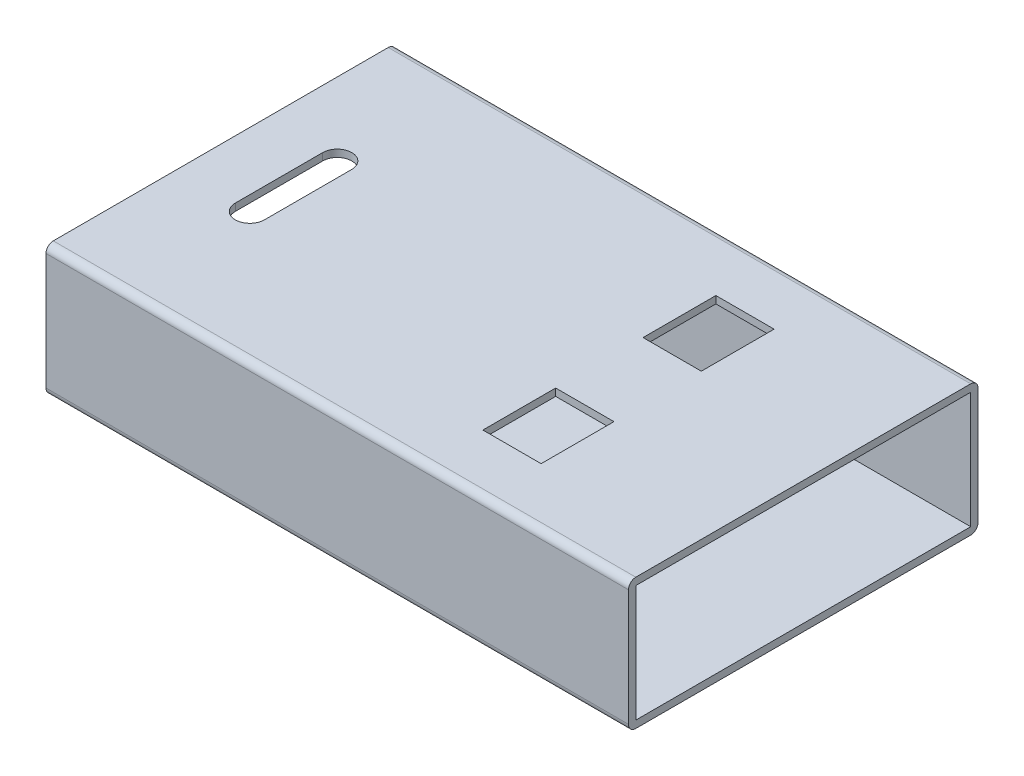
ISO-10303-21;
HEADER;
FILE_DESCRIPTION(('STEP AP214'),'2;1');
FILE_NAME('part.step','',(''),(''),'','','');
FILE_SCHEMA(('AUTOMOTIVE_DESIGN { 1 0 10303 214 1 1 1 1 }'));
ENDSEC;
DATA;
#1=APPLICATION_CONTEXT('core data for automotive mechanical design processes');
#2=APPLICATION_PROTOCOL_DEFINITION('international standard','automotive_design',2000,#1);
#3=PRODUCT_CONTEXT('',#1,'mechanical');
#4=PRODUCT('Part','Part','',(#3));
#5=PRODUCT_RELATED_PRODUCT_CATEGORY('part','',(#4));
#6=PRODUCT_DEFINITION_FORMATION('','',#4);
#7=PRODUCT_DEFINITION_CONTEXT('part definition',#1,'design');
#8=PRODUCT_DEFINITION('design','',#6,#7);
#9=PRODUCT_DEFINITION_SHAPE('','',#8);
#10=(LENGTH_UNIT() NAMED_UNIT(*) SI_UNIT(.MILLI.,.METRE.));
#11=(NAMED_UNIT(*) PLANE_ANGLE_UNIT() SI_UNIT($,.RADIAN.));
#12=(NAMED_UNIT(*) SI_UNIT($,.STERADIAN.) SOLID_ANGLE_UNIT());
#13=UNCERTAINTY_MEASURE_WITH_UNIT(LENGTH_MEASURE(1.E-05),#10,'distance_accuracy_value','');
#14=(GEOMETRIC_REPRESENTATION_CONTEXT(3) GLOBAL_UNCERTAINTY_ASSIGNED_CONTEXT((#13)) GLOBAL_UNIT_ASSIGNED_CONTEXT((#10,
#11,#12)) REPRESENTATION_CONTEXT('',''));
#15=CARTESIAN_POINT('',(0.,0.,0.));
#16=DIRECTION('',(0.,0.,1.));
#17=DIRECTION('',(1.,0.,0.));
#18=AXIS2_PLACEMENT_3D('',#15,#16,#17);
#19=CARTESIAN_POINT('',(-20.,2.,-5.75));
#20=DIRECTION('',(1.,0.,0.));
#21=DIRECTION('',(0.,0.,-1.));
#22=AXIS2_PLACEMENT_3D('',#19,#20,#21);
#23=CYLINDRICAL_SURFACE('',#22,0.25);
#24=CARTESIAN_POINT('',(0.,2.,-5.75));
#25=DIRECTION('',(1.,0.,0.));
#26=DIRECTION('',(0.,0.,1.));
#27=AXIS2_PLACEMENT_3D('',#24,#25,#26);
#28=CIRCLE('',#27,0.25);
#29=CARTESIAN_POINT('',(0.,2.,-6.));
#30=VERTEX_POINT('',#29);
#31=CARTESIAN_POINT('',(0.,2.25,-5.75));
#32=VERTEX_POINT('',#31);
#33=EDGE_CURVE('E488',#30,#32,#28,.T.);
#34=ORIENTED_EDGE('',*,*,#33,.F.);
#35=DIRECTION('',(1.,0.,0.));
#36=VECTOR('',#35,1.);
#37=CARTESIAN_POINT('',(-20.,2.,-6.));
#38=LINE('',#37,#36);
#39=CARTESIAN_POINT('',(-20.,2.,-6.));
#40=VERTEX_POINT('',#39);
#41=EDGE_CURVE('E543',#40,#30,#38,.T.);
#42=ORIENTED_EDGE('',*,*,#41,.F.);
#43=CARTESIAN_POINT('',(-20.,2.,-5.75));
#44=DIRECTION('',(1.,0.,0.));
#45=DIRECTION('',(0.,0.,1.));
#46=AXIS2_PLACEMENT_3D('',#43,#44,#45);
#47=CIRCLE('',#46,0.25);
#48=CARTESIAN_POINT('',(-20.,2.25,-5.75));
#49=VERTEX_POINT('',#48);
#50=EDGE_CURVE('E495',#40,#49,#47,.T.);
#51=ORIENTED_EDGE('',*,*,#50,.T.);
#52=DIRECTION('',(1.,0.,0.));
#53=VECTOR('',#52,1.);
#54=CARTESIAN_POINT('',(-20.,2.25,-5.75));
#55=LINE('',#54,#53);
#56=EDGE_CURVE('E520',#49,#32,#55,.T.);
#57=ORIENTED_EDGE('',*,*,#56,.T.);
#58=EDGE_LOOP('',(#34,#42,#51,#57));
#59=FACE_BOUND('',#58,.T.);
#60=ADVANCED_FACE('F73',(#59),#23,.T.);
#61=CARTESIAN_POINT('',(-20.,-2.,-6.));
#62=DIRECTION('',(0.,0.,-1.));
#63=DIRECTION('',(-1.,0.,0.));
#64=AXIS2_PLACEMENT_3D('',#61,#62,#63);
#65=PLANE('',#64);
#66=DIRECTION('',(0.,1.,0.));
#67=VECTOR('',#66,1.);
#68=CARTESIAN_POINT('',(0.,-2.,-6.));
#69=LINE('',#68,#67);
#70=CARTESIAN_POINT('',(0.,-2.,-6.));
#71=VERTEX_POINT('',#70);
#72=EDGE_CURVE('E499',#71,#30,#69,.T.);
#73=ORIENTED_EDGE('',*,*,#72,.F.);
#74=DIRECTION('',(1.,0.,0.));
#75=VECTOR('',#74,1.);
#76=CARTESIAN_POINT('',(-20.,-2.,-6.));
#77=LINE('',#76,#75);
#78=CARTESIAN_POINT('',(-20.,-2.,-6.));
#79=VERTEX_POINT('',#78);
#80=EDGE_CURVE('E546',#79,#71,#77,.T.);
#81=ORIENTED_EDGE('',*,*,#80,.F.);
#82=DIRECTION('',(0.,1.,0.));
#83=VECTOR('',#82,1.);
#84=CARTESIAN_POINT('',(-20.,-2.,-6.));
#85=LINE('',#84,#83);
#86=EDGE_CURVE('E517',#79,#40,#85,.T.);
#87=ORIENTED_EDGE('',*,*,#86,.T.);
#88=ORIENTED_EDGE('',*,*,#41,.T.);
#89=EDGE_LOOP('',(#73,#81,#87,#88));
#90=FACE_BOUND('',#89,.T.);
#91=ADVANCED_FACE('F618',(#90),#65,.T.);
#92=CARTESIAN_POINT('',(-20.,-2.,-5.75));
#93=DIRECTION('',(1.,0.,0.));
#94=DIRECTION('',(0.,0.,-1.));
#95=AXIS2_PLACEMENT_3D('',#92,#93,#94);
#96=CYLINDRICAL_SURFACE('',#95,0.25);
#97=CARTESIAN_POINT('',(0.,-2.,-5.75));
#98=DIRECTION('',(1.,0.,0.));
#99=DIRECTION('',(0.,0.,-1.));
#100=AXIS2_PLACEMENT_3D('',#97,#98,#99);
#101=CIRCLE('',#100,0.25);
#102=CARTESIAN_POINT('',(0.,-2.25,-5.75));
#103=VERTEX_POINT('',#102);
#104=EDGE_CURVE('E538',#103,#71,#101,.T.);
#105=ORIENTED_EDGE('',*,*,#104,.F.);
#106=DIRECTION('',(1.,0.,0.));
#107=VECTOR('',#106,1.);
#108=CARTESIAN_POINT('',(-20.,-2.25,-5.75));
#109=LINE('',#108,#107);
#110=CARTESIAN_POINT('',(-20.,-2.25,-5.75));
#111=VERTEX_POINT('',#110);
#112=EDGE_CURVE('E548',#111,#103,#109,.T.);
#113=ORIENTED_EDGE('',*,*,#112,.F.);
#114=CARTESIAN_POINT('',(-20.,-2.,-5.75));
#115=DIRECTION('',(1.,0.,0.));
#116=DIRECTION('',(0.,0.,-1.));
#117=AXIS2_PLACEMENT_3D('',#114,#115,#116);
#118=CIRCLE('',#117,0.25);
#119=EDGE_CURVE('E514',#111,#79,#118,.T.);
#120=ORIENTED_EDGE('',*,*,#119,.T.);
#121=ORIENTED_EDGE('',*,*,#80,.T.);
#122=EDGE_LOOP('',(#105,#113,#120,#121));
#123=FACE_BOUND('',#122,.T.);
#124=ADVANCED_FACE('F623',(#123),#96,.T.);
#125=CARTESIAN_POINT('',(-20.,-2.25,5.75));
#126=DIRECTION('',(0.,-1.,0.));
#127=DIRECTION('',(0.,0.,-1.));
#128=AXIS2_PLACEMENT_3D('',#125,#126,#127);
#129=PLANE('',#128);
#130=CARTESIAN_POINT('',(-17.5,-2.25,1.5));
#131=DIRECTION('',(0.,1.,0.));
#132=DIRECTION('',(0.,0.,1.));
#133=AXIS2_PLACEMENT_3D('',#130,#131,#132);
#134=CIRCLE('',#133,0.5);
#135=CARTESIAN_POINT('',(-18.,-2.25,1.5));
#136=VERTEX_POINT('',#135);
#137=CARTESIAN_POINT('',(-17.,-2.25,1.5));
#138=VERTEX_POINT('',#137);
#139=EDGE_CURVE('E312',#136,#138,#134,.T.);
#140=ORIENTED_EDGE('',*,*,#139,.T.);
#141=DIRECTION('',(0.,0.,-1.));
#142=VECTOR('',#141,1.);
#143=CARTESIAN_POINT('',(-17.,-2.25,1.5));
#144=LINE('',#143,#142);
#145=CARTESIAN_POINT('',(-17.,-2.25,-1.5));
#146=VERTEX_POINT('',#145);
#147=EDGE_CURVE('E322',#138,#146,#144,.T.);
#148=ORIENTED_EDGE('',*,*,#147,.T.);
#149=CARTESIAN_POINT('',(-17.5,-2.25,-1.5));
#150=DIRECTION('',(0.,1.,0.));
#151=DIRECTION('',(0.,0.,1.));
#152=AXIS2_PLACEMENT_3D('',#149,#150,#151);
#153=CIRCLE('',#152,0.5);
#154=CARTESIAN_POINT('',(-18.,-2.25,-1.5));
#155=VERTEX_POINT('',#154);
#156=EDGE_CURVE('E87',#146,#155,#153,.T.);
#157=ORIENTED_EDGE('',*,*,#156,.T.);
#158=DIRECTION('',(0.,0.,1.));
#159=VECTOR('',#158,1.);
#160=CARTESIAN_POINT('',(-18.,-2.25,1.5));
#161=LINE('',#160,#159);
#162=EDGE_CURVE('E330',#155,#136,#161,.T.);
#163=ORIENTED_EDGE('',*,*,#162,.T.);
#164=EDGE_LOOP('',(#140,#148,#157,#163));
#165=FACE_BOUND('',#164,.T.);
#166=DIRECTION('',(1.,0.,0.));
#167=VECTOR('',#166,1.);
#168=CARTESIAN_POINT('',(-7.,-2.25,-1.5));
#169=LINE('',#168,#167);
#170=CARTESIAN_POINT('',(-7.,-2.25,-1.5));
#171=VERTEX_POINT('',#170);
#172=CARTESIAN_POINT('',(-5.,-2.25,-1.5));
#173=VERTEX_POINT('',#172);
#174=EDGE_CURVE('E363',#171,#173,#169,.T.);
#175=ORIENTED_EDGE('',*,*,#174,.T.);
#176=DIRECTION('',(0.,0.,-1.));
#177=VECTOR('',#176,1.);
#178=CARTESIAN_POINT('',(-5.,-2.25,-1.5));
#179=LINE('',#178,#177);
#180=CARTESIAN_POINT('',(-5.,-2.25,-4.));
#181=VERTEX_POINT('',#180);
#182=EDGE_CURVE('E366',#173,#181,#179,.T.);
#183=ORIENTED_EDGE('',*,*,#182,.T.);
#184=DIRECTION('',(-1.,0.,0.));
#185=VECTOR('',#184,1.);
#186=CARTESIAN_POINT('',(-7.,-2.25,-4.));
#187=LINE('',#186,#185);
#188=CARTESIAN_POINT('',(-7.,-2.25,-4.));
#189=VERTEX_POINT('',#188);
#190=EDGE_CURVE('E370',#181,#189,#187,.T.);
#191=ORIENTED_EDGE('',*,*,#190,.T.);
#192=DIRECTION('',(0.,0.,1.));
#193=VECTOR('',#192,1.);
#194=CARTESIAN_POINT('',(-7.,-2.25,-1.5));
#195=LINE('',#194,#193);
#196=EDGE_CURVE('E373',#189,#171,#195,.T.);
#197=ORIENTED_EDGE('',*,*,#196,.T.);
#198=EDGE_LOOP('',(#175,#183,#191,#197));
#199=FACE_BOUND('',#198,.T.);
#200=DIRECTION('',(0.,0.,-1.));
#201=VECTOR('',#200,1.);
#202=CARTESIAN_POINT('',(-5.,-2.25,1.5));
#203=LINE('',#202,#201);
#204=CARTESIAN_POINT('',(-5.,-2.25,4.));
#205=VERTEX_POINT('',#204);
#206=CARTESIAN_POINT('',(-5.,-2.25,1.5));
#207=VERTEX_POINT('',#206);
#208=EDGE_CURVE('E413',#205,#207,#203,.T.);
#209=ORIENTED_EDGE('',*,*,#208,.T.);
#210=DIRECTION('',(-1.,0.,0.));
#211=VECTOR('',#210,1.);
#212=CARTESIAN_POINT('',(-7.,-2.25,1.5));
#213=LINE('',#212,#211);
#214=CARTESIAN_POINT('',(-7.,-2.25,1.5));
#215=VERTEX_POINT('',#214);
#216=EDGE_CURVE('E416',#207,#215,#213,.T.);
#217=ORIENTED_EDGE('',*,*,#216,.T.);
#218=DIRECTION('',(0.,0.,1.));
#219=VECTOR('',#218,1.);
#220=CARTESIAN_POINT('',(-7.,-2.25,1.5));
#221=LINE('',#220,#219);
#222=CARTESIAN_POINT('',(-7.,-2.25,4.));
#223=VERTEX_POINT('',#222);
#224=EDGE_CURVE('E420',#215,#223,#221,.T.);
#225=ORIENTED_EDGE('',*,*,#224,.T.);
#226=DIRECTION('',(1.,0.,0.));
#227=VECTOR('',#226,1.);
#228=CARTESIAN_POINT('',(-7.,-2.25,4.));
#229=LINE('',#228,#227);
#230=EDGE_CURVE('E423',#223,#205,#229,.T.);
#231=ORIENTED_EDGE('',*,*,#230,.T.);
#232=EDGE_LOOP('',(#209,#217,#225,#231));
#233=FACE_BOUND('',#232,.T.);
#234=DIRECTION('',(0.,0.,-1.));
#235=VECTOR('',#234,1.);
#236=CARTESIAN_POINT('',(0.,-2.25,5.75));
#237=LINE('',#236,#235);
#238=CARTESIAN_POINT('',(0.,-2.25,5.75));
#239=VERTEX_POINT('',#238);
#240=EDGE_CURVE('E535',#239,#103,#237,.T.);
#241=ORIENTED_EDGE('',*,*,#240,.F.);
#242=DIRECTION('',(1.,0.,0.));
#243=VECTOR('',#242,1.);
#244=CARTESIAN_POINT('',(-20.,-2.25,5.75));
#245=LINE('',#244,#243);
#246=CARTESIAN_POINT('',(-20.,-2.25,5.75));
#247=VERTEX_POINT('',#246);
#248=EDGE_CURVE('E550',#247,#239,#245,.T.);
#249=ORIENTED_EDGE('',*,*,#248,.F.);
#250=DIRECTION('',(0.,0.,-1.));
#251=VECTOR('',#250,1.);
#252=CARTESIAN_POINT('',(-20.,-2.25,5.75));
#253=LINE('',#252,#251);
#254=EDGE_CURVE('E511',#247,#111,#253,.T.);
#255=ORIENTED_EDGE('',*,*,#254,.T.);
#256=ORIENTED_EDGE('',*,*,#112,.T.);
#257=EDGE_LOOP('',(#241,#249,#255,#256));
#258=FACE_BOUND('',#257,.T.);
#259=ADVANCED_FACE('F327',(#165,#199,#233,#258),#129,.T.);
#260=CARTESIAN_POINT('',(-20.,-2.,5.75));
#261=DIRECTION('',(1.,0.,0.));
#262=DIRECTION('',(0.,0.,-1.));
#263=AXIS2_PLACEMENT_3D('',#260,#261,#262);
#264=CYLINDRICAL_SURFACE('',#263,0.25);
#265=CARTESIAN_POINT('',(0.,-2.,5.75));
#266=DIRECTION('',(1.,0.,0.));
#267=DIRECTION('',(0.,0.,1.));
#268=AXIS2_PLACEMENT_3D('',#265,#266,#267);
#269=CIRCLE('',#268,0.25);
#270=CARTESIAN_POINT('',(0.,-2.,6.));
#271=VERTEX_POINT('',#270);
#272=EDGE_CURVE('E532',#271,#239,#269,.T.);
#273=ORIENTED_EDGE('',*,*,#272,.F.);
#274=DIRECTION('',(1.,0.,0.));
#275=VECTOR('',#274,1.);
#276=CARTESIAN_POINT('',(-20.,-2.,6.));
#277=LINE('',#276,#275);
#278=CARTESIAN_POINT('',(-20.,-2.,6.));
#279=VERTEX_POINT('',#278);
#280=EDGE_CURVE('E552',#279,#271,#277,.T.);
#281=ORIENTED_EDGE('',*,*,#280,.F.);
#282=CARTESIAN_POINT('',(-20.,-2.,5.75));
#283=DIRECTION('',(1.,0.,0.));
#284=DIRECTION('',(0.,0.,1.));
#285=AXIS2_PLACEMENT_3D('',#282,#283,#284);
#286=CIRCLE('',#285,0.25);
#287=EDGE_CURVE('E508',#279,#247,#286,.T.);
#288=ORIENTED_EDGE('',*,*,#287,.T.);
#289=ORIENTED_EDGE('',*,*,#248,.T.);
#290=EDGE_LOOP('',(#273,#281,#288,#289));
#291=FACE_BOUND('',#290,.T.);
#292=ADVANCED_FACE('F651',(#291),#264,.T.);
#293=CARTESIAN_POINT('',(-20.,-2.,6.));
#294=DIRECTION('',(0.,0.,1.));
#295=DIRECTION('',(1.,0.,0.));
#296=AXIS2_PLACEMENT_3D('',#293,#294,#295);
#297=PLANE('',#296);
#298=DIRECTION('',(0.,-1.,0.));
#299=VECTOR('',#298,1.);
#300=CARTESIAN_POINT('',(0.,-2.,6.));
#301=LINE('',#300,#299);
#302=CARTESIAN_POINT('',(0.,2.,6.));
#303=VERTEX_POINT('',#302);
#304=EDGE_CURVE('E529',#303,#271,#301,.T.);
#305=ORIENTED_EDGE('',*,*,#304,.F.);
#306=DIRECTION('',(1.,0.,0.));
#307=VECTOR('',#306,1.);
#308=CARTESIAN_POINT('',(-20.,2.,6.));
#309=LINE('',#308,#307);
#310=CARTESIAN_POINT('',(-20.,2.,6.));
#311=VERTEX_POINT('',#310);
#312=EDGE_CURVE('E554',#311,#303,#309,.T.);
#313=ORIENTED_EDGE('',*,*,#312,.F.);
#314=DIRECTION('',(0.,-1.,0.));
#315=VECTOR('',#314,1.);
#316=CARTESIAN_POINT('',(-20.,-2.,6.));
#317=LINE('',#316,#315);
#318=EDGE_CURVE('E505',#311,#279,#317,.T.);
#319=ORIENTED_EDGE('',*,*,#318,.T.);
#320=ORIENTED_EDGE('',*,*,#280,.T.);
#321=EDGE_LOOP('',(#305,#313,#319,#320));
#322=FACE_BOUND('',#321,.T.);
#323=ADVANCED_FACE('F647',(#322),#297,.T.);
#324=CARTESIAN_POINT('',(-20.,2.,5.75));
#325=DIRECTION('',(1.,0.,0.));
#326=DIRECTION('',(0.,0.,-1.));
#327=AXIS2_PLACEMENT_3D('',#324,#325,#326);
#328=CYLINDRICAL_SURFACE('',#327,0.25);
#329=CARTESIAN_POINT('',(0.,2.,5.75));
#330=DIRECTION('',(1.,0.,0.));
#331=DIRECTION('',(0.,0.,1.));
#332=AXIS2_PLACEMENT_3D('',#329,#330,#331);
#333=CIRCLE('',#332,0.25);
#334=CARTESIAN_POINT('',(0.,2.25,5.75));
#335=VERTEX_POINT('',#334);
#336=EDGE_CURVE('E526',#335,#303,#333,.T.);
#337=ORIENTED_EDGE('',*,*,#336,.F.);
#338=DIRECTION('',(1.,0.,0.));
#339=VECTOR('',#338,1.);
#340=CARTESIAN_POINT('',(-20.,2.25,5.75));
#341=LINE('',#340,#339);
#342=CARTESIAN_POINT('',(-20.,2.25,5.75));
#343=VERTEX_POINT('',#342);
#344=EDGE_CURVE('E556',#343,#335,#341,.T.);
#345=ORIENTED_EDGE('',*,*,#344,.F.);
#346=CARTESIAN_POINT('',(-20.,2.,5.75));
#347=DIRECTION('',(1.,0.,0.));
#348=DIRECTION('',(0.,0.,1.));
#349=AXIS2_PLACEMENT_3D('',#346,#347,#348);
#350=CIRCLE('',#349,0.25);
#351=EDGE_CURVE('E502',#343,#311,#350,.T.);
#352=ORIENTED_EDGE('',*,*,#351,.T.);
#353=ORIENTED_EDGE('',*,*,#312,.T.);
#354=EDGE_LOOP('',(#337,#345,#352,#353));
#355=FACE_BOUND('',#354,.T.);
#356=ADVANCED_FACE('F645',(#355),#328,.T.);
#357=CARTESIAN_POINT('',(-20.,2.25,5.75));
#358=DIRECTION('',(0.,1.,0.));
#359=DIRECTION('',(0.,0.,1.));
#360=AXIS2_PLACEMENT_3D('',#357,#358,#359);
#361=PLANE('',#360);
#362=CARTESIAN_POINT('',(-17.5,2.25,1.5));
#363=DIRECTION('',(0.,1.,0.));
#364=DIRECTION('',(0.,0.,1.));
#365=AXIS2_PLACEMENT_3D('',#362,#363,#364);
#366=CIRCLE('',#365,0.5);
#367=CARTESIAN_POINT('',(-18.,2.25,1.5));
#368=VERTEX_POINT('',#367);
#369=CARTESIAN_POINT('',(-17.,2.25,1.5));
#370=VERTEX_POINT('',#369);
#371=EDGE_CURVE('E95',#368,#370,#366,.T.);
#372=ORIENTED_EDGE('',*,*,#371,.F.);
#373=DIRECTION('',(0.,0.,1.));
#374=VECTOR('',#373,1.);
#375=CARTESIAN_POINT('',(-18.,2.25,1.5));
#376=LINE('',#375,#374);
#377=CARTESIAN_POINT('',(-18.,2.25,-1.5));
#378=VERTEX_POINT('',#377);
#379=EDGE_CURVE('E331',#378,#368,#376,.T.);
#380=ORIENTED_EDGE('',*,*,#379,.F.);
#381=CARTESIAN_POINT('',(-17.5,2.25,-1.5));
#382=DIRECTION('',(0.,1.,0.));
#383=DIRECTION('',(0.,0.,1.));
#384=AXIS2_PLACEMENT_3D('',#381,#382,#383);
#385=CIRCLE('',#384,0.5);
#386=CARTESIAN_POINT('',(-17.,2.25,-1.5));
#387=VERTEX_POINT('',#386);
#388=EDGE_CURVE('E334',#387,#378,#385,.T.);
#389=ORIENTED_EDGE('',*,*,#388,.F.);
#390=DIRECTION('',(0.,0.,-1.));
#391=VECTOR('',#390,1.);
#392=CARTESIAN_POINT('',(-17.,2.25,1.5));
#393=LINE('',#392,#391);
#394=EDGE_CURVE('E340',#370,#387,#393,.T.);
#395=ORIENTED_EDGE('',*,*,#394,.F.);
#396=EDGE_LOOP('',(#372,#380,#389,#395));
#397=FACE_BOUND('',#396,.T.);
#398=DIRECTION('',(1.,0.,0.));
#399=VECTOR('',#398,1.);
#400=CARTESIAN_POINT('',(-7.,2.25,-1.5));
#401=LINE('',#400,#399);
#402=CARTESIAN_POINT('',(-7.,2.25,-1.5));
#403=VERTEX_POINT('',#402);
#404=CARTESIAN_POINT('',(-5.,2.25,-1.5));
#405=VERTEX_POINT('',#404);
#406=EDGE_CURVE('E362',#403,#405,#401,.T.);
#407=ORIENTED_EDGE('',*,*,#406,.F.);
#408=DIRECTION('',(0.,0.,1.));
#409=VECTOR('',#408,1.);
#410=CARTESIAN_POINT('',(-7.,2.25,-1.5));
#411=LINE('',#410,#409);
#412=CARTESIAN_POINT('',(-7.,2.25,-4.));
#413=VERTEX_POINT('',#412);
#414=EDGE_CURVE('E367',#413,#403,#411,.T.);
#415=ORIENTED_EDGE('',*,*,#414,.F.);
#416=DIRECTION('',(-1.,0.,0.));
#417=VECTOR('',#416,1.);
#418=CARTESIAN_POINT('',(-7.,2.25,-4.));
#419=LINE('',#418,#417);
#420=CARTESIAN_POINT('',(-5.,2.25,-4.));
#421=VERTEX_POINT('',#420);
#422=EDGE_CURVE('E381',#421,#413,#419,.T.);
#423=ORIENTED_EDGE('',*,*,#422,.F.);
#424=DIRECTION('',(0.,0.,-1.));
#425=VECTOR('',#424,1.);
#426=CARTESIAN_POINT('',(-5.,2.25,-1.5));
#427=LINE('',#426,#425);
#428=EDGE_CURVE('E378',#405,#421,#427,.T.);
#429=ORIENTED_EDGE('',*,*,#428,.F.);
#430=EDGE_LOOP('',(#407,#415,#423,#429));
#431=FACE_BOUND('',#430,.T.);
#432=DIRECTION('',(0.,0.,-1.));
#433=VECTOR('',#432,1.);
#434=CARTESIAN_POINT('',(-5.,2.25,1.5));
#435=LINE('',#434,#433);
#436=CARTESIAN_POINT('',(-5.,2.25,4.));
#437=VERTEX_POINT('',#436);
#438=CARTESIAN_POINT('',(-5.,2.25,1.5));
#439=VERTEX_POINT('',#438);
#440=EDGE_CURVE('E412',#437,#439,#435,.T.);
#441=ORIENTED_EDGE('',*,*,#440,.F.);
#442=DIRECTION('',(1.,0.,0.));
#443=VECTOR('',#442,1.);
#444=CARTESIAN_POINT('',(-7.,2.25,4.));
#445=LINE('',#444,#443);
#446=CARTESIAN_POINT('',(-7.,2.25,4.));
#447=VERTEX_POINT('',#446);
#448=EDGE_CURVE('E417',#447,#437,#445,.T.);
#449=ORIENTED_EDGE('',*,*,#448,.F.);
#450=DIRECTION('',(0.,0.,1.));
#451=VECTOR('',#450,1.);
#452=CARTESIAN_POINT('',(-7.,2.25,1.5));
#453=LINE('',#452,#451);
#454=CARTESIAN_POINT('',(-7.,2.25,1.5));
#455=VERTEX_POINT('',#454);
#456=EDGE_CURVE('E431',#455,#447,#453,.T.);
#457=ORIENTED_EDGE('',*,*,#456,.F.);
#458=DIRECTION('',(-1.,0.,0.));
#459=VECTOR('',#458,1.);
#460=CARTESIAN_POINT('',(-7.,2.25,1.5));
#461=LINE('',#460,#459);
#462=EDGE_CURVE('E428',#439,#455,#461,.T.);
#463=ORIENTED_EDGE('',*,*,#462,.F.);
#464=EDGE_LOOP('',(#441,#449,#457,#463));
#465=FACE_BOUND('',#464,.T.);
#466=DIRECTION('',(0.,0.,1.));
#467=VECTOR('',#466,1.);
#468=CARTESIAN_POINT('',(0.,2.25,5.75));
#469=LINE('',#468,#467);
#470=EDGE_CURVE('E523',#32,#335,#469,.T.);
#471=ORIENTED_EDGE('',*,*,#470,.F.);
#472=ORIENTED_EDGE('',*,*,#56,.F.);
#473=DIRECTION('',(0.,0.,1.));
#474=VECTOR('',#473,1.);
#475=CARTESIAN_POINT('',(-20.,2.25,5.75));
#476=LINE('',#475,#474);
#477=EDGE_CURVE('E498',#49,#343,#476,.T.);
#478=ORIENTED_EDGE('',*,*,#477,.T.);
#479=ORIENTED_EDGE('',*,*,#344,.T.);
#480=EDGE_LOOP('',(#471,#472,#478,#479));
#481=FACE_BOUND('',#480,.T.);
#482=ADVANCED_FACE('F602',(#397,#431,#465,#481),#361,.T.);
#483=CARTESIAN_POINT('',(-20.,2.,-5.75));
#484=DIRECTION('',(1.,0.,0.));
#485=DIRECTION('',(0.,0.,-1.));
#486=AXIS2_PLACEMENT_3D('',#483,#484,#485);
#487=PLANE('',#486);
#488=DIRECTION('',(0.,0.,-1.));
#489=VECTOR('',#488,1.);
#490=CARTESIAN_POINT('',(-20.,-2.,-5.75));
#491=LINE('',#490,#489);
#492=CARTESIAN_POINT('',(-20.,-2.,5.75));
#493=VERTEX_POINT('',#492);
#494=CARTESIAN_POINT('',(-20.,-2.,-5.75));
#495=VERTEX_POINT('',#494);
#496=EDGE_CURVE('E473',#493,#495,#491,.T.);
#497=ORIENTED_EDGE('',*,*,#496,.T.);
#498=DIRECTION('',(0.,1.,0.));
#499=VECTOR('',#498,1.);
#500=CARTESIAN_POINT('',(-20.,2.,-5.75));
#501=LINE('',#500,#499);
#502=CARTESIAN_POINT('',(-20.,2.,-5.75));
#503=VERTEX_POINT('',#502);
#504=EDGE_CURVE('E463',#495,#503,#501,.T.);
#505=ORIENTED_EDGE('',*,*,#504,.T.);
#506=DIRECTION('',(0.,0.,1.));
#507=VECTOR('',#506,1.);
#508=CARTESIAN_POINT('',(-20.,2.,-5.75));
#509=LINE('',#508,#507);
#510=CARTESIAN_POINT('',(-20.,2.,5.75));
#511=VERTEX_POINT('',#510);
#512=EDGE_CURVE('E466',#503,#511,#509,.T.);
#513=ORIENTED_EDGE('',*,*,#512,.T.);
#514=DIRECTION('',(0.,-1.,0.));
#515=VECTOR('',#514,1.);
#516=CARTESIAN_POINT('',(-20.,2.,5.75));
#517=LINE('',#516,#515);
#518=EDGE_CURVE('E470',#511,#493,#517,.T.);
#519=ORIENTED_EDGE('',*,*,#518,.T.);
#520=EDGE_LOOP('',(#497,#505,#513,#519));
#521=FACE_BOUND('',#520,.T.);
#522=ORIENTED_EDGE('',*,*,#50,.F.);
#523=ORIENTED_EDGE('',*,*,#86,.F.);
#524=ORIENTED_EDGE('',*,*,#119,.F.);
#525=ORIENTED_EDGE('',*,*,#254,.F.);
#526=ORIENTED_EDGE('',*,*,#287,.F.);
#527=ORIENTED_EDGE('',*,*,#318,.F.);
#528=ORIENTED_EDGE('',*,*,#351,.F.);
#529=ORIENTED_EDGE('',*,*,#477,.F.);
#530=EDGE_LOOP('',(#522,#523,#524,#525,#526,#527,#528,#529));
#531=FACE_BOUND('',#530,.T.);
#532=ADVANCED_FACE('F636',(#521,#531),#487,.F.);
#533=CARTESIAN_POINT('',(0.,2.,-5.75));
#534=DIRECTION('',(1.,0.,0.));
#535=DIRECTION('',(0.,0.,-1.));
#536=AXIS2_PLACEMENT_3D('',#533,#534,#535);
#537=PLANE('',#536);
#538=DIRECTION('',(0.,1.,0.));
#539=VECTOR('',#538,1.);
#540=CARTESIAN_POINT('',(0.,2.,-5.75));
#541=LINE('',#540,#539);
#542=CARTESIAN_POINT('',(0.,-2.,-5.75));
#543=VERTEX_POINT('',#542);
#544=CARTESIAN_POINT('',(0.,2.,-5.75));
#545=VERTEX_POINT('',#544);
#546=EDGE_CURVE('E462',#543,#545,#541,.T.);
#547=ORIENTED_EDGE('',*,*,#546,.F.);
#548=DIRECTION('',(0.,0.,-1.));
#549=VECTOR('',#548,1.);
#550=CARTESIAN_POINT('',(0.,-2.,-5.75));
#551=LINE('',#550,#549);
#552=CARTESIAN_POINT('',(0.,-2.,5.75));
#553=VERTEX_POINT('',#552);
#554=EDGE_CURVE('E467',#553,#543,#551,.T.);
#555=ORIENTED_EDGE('',*,*,#554,.F.);
#556=DIRECTION('',(0.,-1.,0.));
#557=VECTOR('',#556,1.);
#558=CARTESIAN_POINT('',(0.,2.,5.75));
#559=LINE('',#558,#557);
#560=CARTESIAN_POINT('',(0.,2.,5.75));
#561=VERTEX_POINT('',#560);
#562=EDGE_CURVE('E481',#561,#553,#559,.T.);
#563=ORIENTED_EDGE('',*,*,#562,.F.);
#564=DIRECTION('',(0.,0.,1.));
#565=VECTOR('',#564,1.);
#566=CARTESIAN_POINT('',(0.,2.,-5.75));
#567=LINE('',#566,#565);
#568=EDGE_CURVE('E478',#545,#561,#567,.T.);
#569=ORIENTED_EDGE('',*,*,#568,.F.);
#570=EDGE_LOOP('',(#547,#555,#563,#569));
#571=FACE_BOUND('',#570,.T.);
#572=ORIENTED_EDGE('',*,*,#33,.T.);
#573=ORIENTED_EDGE('',*,*,#470,.T.);
#574=ORIENTED_EDGE('',*,*,#336,.T.);
#575=ORIENTED_EDGE('',*,*,#304,.T.);
#576=ORIENTED_EDGE('',*,*,#272,.T.);
#577=ORIENTED_EDGE('',*,*,#240,.T.);
#578=ORIENTED_EDGE('',*,*,#104,.T.);
#579=ORIENTED_EDGE('',*,*,#72,.T.);
#580=EDGE_LOOP('',(#572,#573,#574,#575,#576,#577,#578,#579));
#581=FACE_BOUND('',#580,.T.);
#582=ADVANCED_FACE('F631',(#571,#581),#537,.T.);
#583=CARTESIAN_POINT('',(-20.,2.,-5.75));
#584=DIRECTION('',(0.,0.,-1.));
#585=DIRECTION('',(-1.,0.,0.));
#586=AXIS2_PLACEMENT_3D('',#583,#584,#585);
#587=PLANE('',#586);
#588=ORIENTED_EDGE('',*,*,#546,.T.);
#589=DIRECTION('',(1.,0.,0.));
#590=VECTOR('',#589,1.);
#591=CARTESIAN_POINT('',(-20.,2.,-5.75));
#592=LINE('',#591,#590);
#593=EDGE_CURVE('E476',#503,#545,#592,.T.);
#594=ORIENTED_EDGE('',*,*,#593,.F.);
#595=ORIENTED_EDGE('',*,*,#504,.F.);
#596=DIRECTION('',(1.,0.,0.));
#597=VECTOR('',#596,1.);
#598=CARTESIAN_POINT('',(-20.,-2.,-5.75));
#599=LINE('',#598,#597);
#600=EDGE_CURVE('E486',#495,#543,#599,.T.);
#601=ORIENTED_EDGE('',*,*,#600,.T.);
#602=EDGE_LOOP('',(#588,#594,#595,#601));
#603=FACE_BOUND('',#602,.T.);
#604=ADVANCED_FACE('F677',(#603),#587,.F.);
#605=CARTESIAN_POINT('',(-20.,-2.,-5.75));
#606=DIRECTION('',(0.,-1.,0.));
#607=DIRECTION('',(0.,0.,-1.));
#608=AXIS2_PLACEMENT_3D('',#605,#606,#607);
#609=PLANE('',#608);
#610=DIRECTION('',(0.,0.,1.));
#611=VECTOR('',#610,1.);
#612=CARTESIAN_POINT('',(-17.,-2.,-5.75));
#613=LINE('',#612,#611);
#614=CARTESIAN_POINT('',(-17.,-2.,-1.5));
#615=VERTEX_POINT('',#614);
#616=CARTESIAN_POINT('',(-17.,-2.,1.5));
#617=VERTEX_POINT('',#616);
#618=EDGE_CURVE('E347',#615,#617,#613,.T.);
#619=ORIENTED_EDGE('',*,*,#618,.T.);
#620=CARTESIAN_POINT('',(-17.5,-2.,1.5));
#621=DIRECTION('',(0.,-1.,0.));
#622=DIRECTION('',(0.,0.,-1.));
#623=AXIS2_PLACEMENT_3D('',#620,#621,#622);
#624=CIRCLE('',#623,0.5);
#625=CARTESIAN_POINT('',(-18.,-2.,1.5));
#626=VERTEX_POINT('',#625);
#627=EDGE_CURVE('E315',#617,#626,#624,.T.);
#628=ORIENTED_EDGE('',*,*,#627,.T.);
#629=DIRECTION('',(0.,0.,-1.));
#630=VECTOR('',#629,1.);
#631=CARTESIAN_POINT('',(-18.,-2.,-5.75));
#632=LINE('',#631,#630);
#633=CARTESIAN_POINT('',(-18.,-2.,-1.5));
#634=VERTEX_POINT('',#633);
#635=EDGE_CURVE('E358',#626,#634,#632,.T.);
#636=ORIENTED_EDGE('',*,*,#635,.T.);
#637=CARTESIAN_POINT('',(-17.5,-2.,-1.5));
#638=DIRECTION('',(0.,-1.,0.));
#639=DIRECTION('',(0.,0.,-1.));
#640=AXIS2_PLACEMENT_3D('',#637,#638,#639);
#641=CIRCLE('',#640,0.5);
#642=EDGE_CURVE('E355',#634,#615,#641,.T.);
#643=ORIENTED_EDGE('',*,*,#642,.T.);
#644=EDGE_LOOP('',(#619,#628,#636,#643));
#645=FACE_BOUND('',#644,.T.);
#646=DIRECTION('',(0.,0.,1.));
#647=VECTOR('',#646,1.);
#648=CARTESIAN_POINT('',(-5.,-2.,-5.75));
#649=LINE('',#648,#647);
#650=CARTESIAN_POINT('',(-5.,-2.,-4.));
#651=VERTEX_POINT('',#650);
#652=CARTESIAN_POINT('',(-5.,-2.,-1.5));
#653=VERTEX_POINT('',#652);
#654=EDGE_CURVE('E389',#651,#653,#649,.T.);
#655=ORIENTED_EDGE('',*,*,#654,.T.);
#656=DIRECTION('',(-1.,0.,0.));
#657=VECTOR('',#656,1.);
#658=CARTESIAN_POINT('',(-20.,-2.,-1.5));
#659=LINE('',#658,#657);
#660=CARTESIAN_POINT('',(-7.,-2.,-1.5));
#661=VERTEX_POINT('',#660);
#662=EDGE_CURVE('E409',#653,#661,#659,.T.);
#663=ORIENTED_EDGE('',*,*,#662,.T.);
#664=DIRECTION('',(0.,0.,-1.));
#665=VECTOR('',#664,1.);
#666=CARTESIAN_POINT('',(-7.,-2.,-5.75));
#667=LINE('',#666,#665);
#668=CARTESIAN_POINT('',(-7.,-2.,-4.));
#669=VERTEX_POINT('',#668);
#670=EDGE_CURVE('E406',#661,#669,#667,.T.);
#671=ORIENTED_EDGE('',*,*,#670,.T.);
#672=DIRECTION('',(1.,0.,0.));
#673=VECTOR('',#672,1.);
#674=CARTESIAN_POINT('',(-20.,-2.,-3.99999999999999));
#675=LINE('',#674,#673);
#676=EDGE_CURVE('E403',#669,#651,#675,.T.);
#677=ORIENTED_EDGE('',*,*,#676,.T.);
#678=EDGE_LOOP('',(#655,#663,#671,#677));
#679=FACE_BOUND('',#678,.T.);
#680=DIRECTION('',(1.,0.,0.));
#681=VECTOR('',#680,1.);
#682=CARTESIAN_POINT('',(-20.,-2.,1.5));
#683=LINE('',#682,#681);
#684=CARTESIAN_POINT('',(-7.,-2.,1.5));
#685=VERTEX_POINT('',#684);
#686=CARTESIAN_POINT('',(-5.,-2.,1.5));
#687=VERTEX_POINT('',#686);
#688=EDGE_CURVE('E439',#685,#687,#683,.T.);
#689=ORIENTED_EDGE('',*,*,#688,.T.);
#690=DIRECTION('',(0.,0.,1.));
#691=VECTOR('',#690,1.);
#692=CARTESIAN_POINT('',(-5.,-2.,-5.75000000000001));
#693=LINE('',#692,#691);
#694=CARTESIAN_POINT('',(-5.,-2.,4.));
#695=VERTEX_POINT('',#694);
#696=EDGE_CURVE('E459',#687,#695,#693,.T.);
#697=ORIENTED_EDGE('',*,*,#696,.T.);
#698=DIRECTION('',(-1.,0.,0.));
#699=VECTOR('',#698,1.);
#700=CARTESIAN_POINT('',(-20.,-2.,3.99999999999999));
#701=LINE('',#700,#699);
#702=CARTESIAN_POINT('',(-7.,-2.,4.));
#703=VERTEX_POINT('',#702);
#704=EDGE_CURVE('E456',#695,#703,#701,.T.);
#705=ORIENTED_EDGE('',*,*,#704,.T.);
#706=DIRECTION('',(0.,0.,-1.));
#707=VECTOR('',#706,1.);
#708=CARTESIAN_POINT('',(-7.,-2.,-5.75));
#709=LINE('',#708,#707);
#710=EDGE_CURVE('E453',#703,#685,#709,.T.);
#711=ORIENTED_EDGE('',*,*,#710,.T.);
#712=EDGE_LOOP('',(#689,#697,#705,#711));
#713=FACE_BOUND('',#712,.T.);
#714=ORIENTED_EDGE('',*,*,#554,.T.);
#715=ORIENTED_EDGE('',*,*,#600,.F.);
#716=ORIENTED_EDGE('',*,*,#496,.F.);
#717=DIRECTION('',(1.,0.,0.));
#718=VECTOR('',#717,1.);
#719=CARTESIAN_POINT('',(-20.,-2.,5.75));
#720=LINE('',#719,#718);
#721=EDGE_CURVE('E489',#493,#553,#720,.T.);
#722=ORIENTED_EDGE('',*,*,#721,.T.);
#723=EDGE_LOOP('',(#714,#715,#716,#722));
#724=FACE_BOUND('',#723,.T.);
#725=ADVANCED_FACE('F682',(#645,#679,#713,#724),#609,.F.);
#726=CARTESIAN_POINT('',(-20.,2.,5.75));
#727=DIRECTION('',(0.,0.,1.));
#728=DIRECTION('',(1.,0.,0.));
#729=AXIS2_PLACEMENT_3D('',#726,#727,#728);
#730=PLANE('',#729);
#731=ORIENTED_EDGE('',*,*,#562,.T.);
#732=ORIENTED_EDGE('',*,*,#721,.F.);
#733=ORIENTED_EDGE('',*,*,#518,.F.);
#734=DIRECTION('',(1.,0.,0.));
#735=VECTOR('',#734,1.);
#736=CARTESIAN_POINT('',(-20.,2.,5.75));
#737=LINE('',#736,#735);
#738=EDGE_CURVE('E491',#511,#561,#737,.T.);
#739=ORIENTED_EDGE('',*,*,#738,.T.);
#740=EDGE_LOOP('',(#731,#732,#733,#739));
#741=FACE_BOUND('',#740,.T.);
#742=ADVANCED_FACE('F687',(#741),#730,.F.);
#743=CARTESIAN_POINT('',(-20.,2.,-5.75));
#744=DIRECTION('',(0.,1.,0.));
#745=DIRECTION('',(0.,0.,1.));
#746=AXIS2_PLACEMENT_3D('',#743,#744,#745);
#747=PLANE('',#746);
#748=DIRECTION('',(0.,0.,1.));
#749=VECTOR('',#748,1.);
#750=CARTESIAN_POINT('',(-18.,2.,-5.75));
#751=LINE('',#750,#749);
#752=CARTESIAN_POINT('',(-18.,2.,-1.5));
#753=VERTEX_POINT('',#752);
#754=CARTESIAN_POINT('',(-18.,2.,1.5));
#755=VERTEX_POINT('',#754);
#756=EDGE_CURVE('E80',#753,#755,#751,.T.);
#757=ORIENTED_EDGE('',*,*,#756,.T.);
#758=CARTESIAN_POINT('',(-17.5,2.,1.5));
#759=DIRECTION('',(0.,1.,0.));
#760=DIRECTION('',(0.,0.,1.));
#761=AXIS2_PLACEMENT_3D('',#758,#759,#760);
#762=CIRCLE('',#761,0.5);
#763=CARTESIAN_POINT('',(-17.,2.,1.5));
#764=VERTEX_POINT('',#763);
#765=EDGE_CURVE('E12',#755,#764,#762,.T.);
#766=ORIENTED_EDGE('',*,*,#765,.T.);
#767=DIRECTION('',(0.,0.,-1.));
#768=VECTOR('',#767,1.);
#769=CARTESIAN_POINT('',(-17.,2.,-5.75));
#770=LINE('',#769,#768);
#771=CARTESIAN_POINT('',(-17.,2.,-1.5));
#772=VERTEX_POINT('',#771);
#773=EDGE_CURVE('E582',#764,#772,#770,.T.);
#774=ORIENTED_EDGE('',*,*,#773,.T.);
#775=CARTESIAN_POINT('',(-17.5,2.,-1.5));
#776=DIRECTION('',(0.,1.,0.));
#777=DIRECTION('',(0.,0.,1.));
#778=AXIS2_PLACEMENT_3D('',#775,#776,#777);
#779=CIRCLE('',#778,0.5);
#780=EDGE_CURVE('E585',#772,#753,#779,.T.);
#781=ORIENTED_EDGE('',*,*,#780,.T.);
#782=EDGE_LOOP('',(#757,#766,#774,#781));
#783=FACE_BOUND('',#782,.T.);
#784=DIRECTION('',(0.,0.,1.));
#785=VECTOR('',#784,1.);
#786=CARTESIAN_POINT('',(-7.,2.,-5.75));
#787=LINE('',#786,#785);
#788=CARTESIAN_POINT('',(-7.,2.,-4.));
#789=VERTEX_POINT('',#788);
#790=CARTESIAN_POINT('',(-7.,2.,-1.5));
#791=VERTEX_POINT('',#790);
#792=EDGE_CURVE('E576',#789,#791,#787,.T.);
#793=ORIENTED_EDGE('',*,*,#792,.T.);
#794=DIRECTION('',(1.,0.,0.));
#795=VECTOR('',#794,1.);
#796=CARTESIAN_POINT('',(-20.,2.,-1.5));
#797=LINE('',#796,#795);
#798=CARTESIAN_POINT('',(-5.,2.,-1.5));
#799=VERTEX_POINT('',#798);
#800=EDGE_CURVE('E579',#791,#799,#797,.T.);
#801=ORIENTED_EDGE('',*,*,#800,.T.);
#802=DIRECTION('',(0.,0.,-1.));
#803=VECTOR('',#802,1.);
#804=CARTESIAN_POINT('',(-5.,2.,-5.75));
#805=LINE('',#804,#803);
#806=CARTESIAN_POINT('',(-5.,2.,-4.));
#807=VERTEX_POINT('',#806);
#808=EDGE_CURVE('E570',#799,#807,#805,.T.);
#809=ORIENTED_EDGE('',*,*,#808,.T.);
#810=DIRECTION('',(-1.,0.,0.));
#811=VECTOR('',#810,1.);
#812=CARTESIAN_POINT('',(-20.,2.,-3.99999999999999));
#813=LINE('',#812,#811);
#814=EDGE_CURVE('E573',#807,#789,#813,.T.);
#815=ORIENTED_EDGE('',*,*,#814,.T.);
#816=EDGE_LOOP('',(#793,#801,#809,#815));
#817=FACE_BOUND('',#816,.T.);
#818=DIRECTION('',(1.,0.,0.));
#819=VECTOR('',#818,1.);
#820=CARTESIAN_POINT('',(-20.,2.,3.99999999999999));
#821=LINE('',#820,#819);
#822=CARTESIAN_POINT('',(-7.,2.,4.));
#823=VERTEX_POINT('',#822);
#824=CARTESIAN_POINT('',(-5.,2.,4.));
#825=VERTEX_POINT('',#824);
#826=EDGE_CURVE('E564',#823,#825,#821,.T.);
#827=ORIENTED_EDGE('',*,*,#826,.T.);
#828=DIRECTION('',(0.,0.,-1.));
#829=VECTOR('',#828,1.);
#830=CARTESIAN_POINT('',(-5.,2.,-5.75000000000001));
#831=LINE('',#830,#829);
#832=CARTESIAN_POINT('',(-5.,2.,1.5));
#833=VERTEX_POINT('',#832);
#834=EDGE_CURVE('E567',#825,#833,#831,.T.);
#835=ORIENTED_EDGE('',*,*,#834,.T.);
#836=DIRECTION('',(-1.,0.,0.));
#837=VECTOR('',#836,1.);
#838=CARTESIAN_POINT('',(-20.,2.,1.5));
#839=LINE('',#838,#837);
#840=CARTESIAN_POINT('',(-7.,2.,1.5));
#841=VERTEX_POINT('',#840);
#842=EDGE_CURVE('E545',#833,#841,#839,.T.);
#843=ORIENTED_EDGE('',*,*,#842,.T.);
#844=DIRECTION('',(0.,0.,1.));
#845=VECTOR('',#844,1.);
#846=CARTESIAN_POINT('',(-7.,2.,-5.75));
#847=LINE('',#846,#845);
#848=EDGE_CURVE('E561',#841,#823,#847,.T.);
#849=ORIENTED_EDGE('',*,*,#848,.T.);
#850=EDGE_LOOP('',(#827,#835,#843,#849));
#851=FACE_BOUND('',#850,.T.);
#852=ORIENTED_EDGE('',*,*,#568,.T.);
#853=ORIENTED_EDGE('',*,*,#738,.F.);
#854=ORIENTED_EDGE('',*,*,#512,.F.);
#855=ORIENTED_EDGE('',*,*,#593,.T.);
#856=EDGE_LOOP('',(#852,#853,#854,#855));
#857=FACE_BOUND('',#856,.T.);
#858=ADVANCED_FACE('F589',(#783,#817,#851,#857),#747,.F.);
#859=CARTESIAN_POINT('',(-7.,-2.25,1.5));
#860=DIRECTION('',(0.,0.,-1.));
#861=DIRECTION('',(-1.,0.,0.));
#862=AXIS2_PLACEMENT_3D('',#859,#860,#861);
#863=PLANE('',#862);
#864=DIRECTION('',(0.,1.,0.));
#865=VECTOR('',#864,1.);
#866=CARTESIAN_POINT('',(-5.,-2.25,1.5));
#867=LINE('',#866,#865);
#868=EDGE_CURVE('E426',#833,#439,#867,.T.);
#869=ORIENTED_EDGE('',*,*,#868,.T.);
#870=ORIENTED_EDGE('',*,*,#462,.T.);
#871=DIRECTION('',(0.,1.,0.));
#872=VECTOR('',#871,1.);
#873=CARTESIAN_POINT('',(-7.,-2.25,1.5));
#874=LINE('',#873,#872);
#875=EDGE_CURVE('E448',#841,#455,#874,.T.);
#876=ORIENTED_EDGE('',*,*,#875,.F.);
#877=ORIENTED_EDGE('',*,*,#842,.F.);
#878=EDGE_LOOP('',(#869,#870,#876,#877));
#879=FACE_BOUND('',#878,.T.);
#880=ADVANCED_FACE('F686',(#879),#863,.F.);
#881=CARTESIAN_POINT('',(-7.,-2.25,1.5));
#882=DIRECTION('',(-1.,0.,0.));
#883=DIRECTION('',(0.,0.,1.));
#884=AXIS2_PLACEMENT_3D('',#881,#882,#883);
#885=PLANE('',#884);
#886=ORIENTED_EDGE('',*,*,#875,.T.);
#887=ORIENTED_EDGE('',*,*,#456,.T.);
#888=DIRECTION('',(0.,1.,0.));
#889=VECTOR('',#888,1.);
#890=CARTESIAN_POINT('',(-7.,-2.25,4.));
#891=LINE('',#890,#889);
#892=EDGE_CURVE('E444',#823,#447,#891,.T.);
#893=ORIENTED_EDGE('',*,*,#892,.F.);
#894=ORIENTED_EDGE('',*,*,#848,.F.);
#895=EDGE_LOOP('',(#886,#887,#893,#894));
#896=FACE_BOUND('',#895,.T.);
#897=ADVANCED_FACE('F709',(#896),#885,.F.);
#898=CARTESIAN_POINT('',(-7.,-2.25,4.));
#899=DIRECTION('',(0.,0.,1.));
#900=DIRECTION('',(1.,0.,0.));
#901=AXIS2_PLACEMENT_3D('',#898,#899,#900);
#902=PLANE('',#901);
#903=ORIENTED_EDGE('',*,*,#892,.T.);
#904=ORIENTED_EDGE('',*,*,#448,.T.);
#905=DIRECTION('',(0.,1.,0.));
#906=VECTOR('',#905,1.);
#907=CARTESIAN_POINT('',(-5.,-2.25,4.));
#908=LINE('',#907,#906);
#909=EDGE_CURVE('E440',#825,#437,#908,.T.);
#910=ORIENTED_EDGE('',*,*,#909,.F.);
#911=ORIENTED_EDGE('',*,*,#826,.F.);
#912=EDGE_LOOP('',(#903,#904,#910,#911));
#913=FACE_BOUND('',#912,.T.);
#914=ADVANCED_FACE('F713',(#913),#902,.F.);
#915=CARTESIAN_POINT('',(-5.,-2.25,1.5));
#916=DIRECTION('',(1.,0.,0.));
#917=DIRECTION('',(0.,0.,-1.));
#918=AXIS2_PLACEMENT_3D('',#915,#916,#917);
#919=PLANE('',#918);
#920=ORIENTED_EDGE('',*,*,#909,.T.);
#921=ORIENTED_EDGE('',*,*,#440,.T.);
#922=ORIENTED_EDGE('',*,*,#868,.F.);
#923=ORIENTED_EDGE('',*,*,#834,.F.);
#924=EDGE_LOOP('',(#920,#921,#922,#923));
#925=FACE_BOUND('',#924,.T.);
#926=ADVANCED_FACE('F698',(#925),#919,.F.);
#927=EDGE_CURVE('E449',#207,#687,#867,.T.);
#928=ORIENTED_EDGE('',*,*,#927,.F.);
#929=ORIENTED_EDGE('',*,*,#208,.F.);
#930=EDGE_CURVE('E436',#205,#695,#908,.T.);
#931=ORIENTED_EDGE('',*,*,#930,.T.);
#932=ORIENTED_EDGE('',*,*,#696,.F.);
#933=EDGE_LOOP('',(#928,#929,#931,#932));
#934=FACE_BOUND('',#933,.T.);
#935=ADVANCED_FACE('F694',(#934),#919,.F.);
#936=ORIENTED_EDGE('',*,*,#930,.F.);
#937=ORIENTED_EDGE('',*,*,#230,.F.);
#938=EDGE_CURVE('E441',#223,#703,#891,.T.);
#939=ORIENTED_EDGE('',*,*,#938,.T.);
#940=ORIENTED_EDGE('',*,*,#704,.F.);
#941=EDGE_LOOP('',(#936,#937,#939,#940));
#942=FACE_BOUND('',#941,.T.);
#943=ADVANCED_FACE('F697',(#942),#902,.F.);
#944=ORIENTED_EDGE('',*,*,#938,.F.);
#945=ORIENTED_EDGE('',*,*,#224,.F.);
#946=EDGE_CURVE('E445',#215,#685,#874,.T.);
#947=ORIENTED_EDGE('',*,*,#946,.T.);
#948=ORIENTED_EDGE('',*,*,#710,.F.);
#949=EDGE_LOOP('',(#944,#945,#947,#948));
#950=FACE_BOUND('',#949,.T.);
#951=ADVANCED_FACE('F704',(#950),#885,.F.);
#952=ORIENTED_EDGE('',*,*,#946,.F.);
#953=ORIENTED_EDGE('',*,*,#216,.F.);
#954=ORIENTED_EDGE('',*,*,#927,.T.);
#955=ORIENTED_EDGE('',*,*,#688,.F.);
#956=EDGE_LOOP('',(#952,#953,#954,#955));
#957=FACE_BOUND('',#956,.T.);
#958=ADVANCED_FACE('F700',(#957),#863,.F.);
#959=CARTESIAN_POINT('',(-5.,-2.25,-1.5));
#960=DIRECTION('',(1.,0.,0.));
#961=DIRECTION('',(0.,0.,-1.));
#962=AXIS2_PLACEMENT_3D('',#959,#960,#961);
#963=PLANE('',#962);
#964=DIRECTION('',(0.,1.,0.));
#965=VECTOR('',#964,1.);
#966=CARTESIAN_POINT('',(-5.,-2.25,-1.5));
#967=LINE('',#966,#965);
#968=EDGE_CURVE('E376',#799,#405,#967,.T.);
#969=ORIENTED_EDGE('',*,*,#968,.T.);
#970=ORIENTED_EDGE('',*,*,#428,.T.);
#971=DIRECTION('',(0.,1.,0.));
#972=VECTOR('',#971,1.);
#973=CARTESIAN_POINT('',(-5.,-2.25,-4.));
#974=LINE('',#973,#972);
#975=EDGE_CURVE('E398',#807,#421,#974,.T.);
#976=ORIENTED_EDGE('',*,*,#975,.F.);
#977=ORIENTED_EDGE('',*,*,#808,.F.);
#978=EDGE_LOOP('',(#969,#970,#976,#977));
#979=FACE_BOUND('',#978,.T.);
#980=ADVANCED_FACE('F703',(#979),#963,.F.);
#981=CARTESIAN_POINT('',(-7.,-2.25,-4.));
#982=DIRECTION('',(0.,0.,-1.));
#983=DIRECTION('',(-1.,0.,0.));
#984=AXIS2_PLACEMENT_3D('',#981,#982,#983);
#985=PLANE('',#984);
#986=ORIENTED_EDGE('',*,*,#975,.T.);
#987=ORIENTED_EDGE('',*,*,#422,.T.);
#988=DIRECTION('',(0.,1.,0.));
#989=VECTOR('',#988,1.);
#990=CARTESIAN_POINT('',(-7.,-2.25,-4.));
#991=LINE('',#990,#989);
#992=EDGE_CURVE('E394',#789,#413,#991,.T.);
#993=ORIENTED_EDGE('',*,*,#992,.F.);
#994=ORIENTED_EDGE('',*,*,#814,.F.);
#995=EDGE_LOOP('',(#986,#987,#993,#994));
#996=FACE_BOUND('',#995,.T.);
#997=ADVANCED_FACE('F727',(#996),#985,.F.);
#998=CARTESIAN_POINT('',(-7.,-2.25,-1.5));
#999=DIRECTION('',(-1.,0.,0.));
#1000=DIRECTION('',(0.,0.,1.));
#1001=AXIS2_PLACEMENT_3D('',#998,#999,#1000);
#1002=PLANE('',#1001);
#1003=ORIENTED_EDGE('',*,*,#992,.T.);
#1004=ORIENTED_EDGE('',*,*,#414,.T.);
#1005=DIRECTION('',(0.,1.,0.));
#1006=VECTOR('',#1005,1.);
#1007=CARTESIAN_POINT('',(-7.,-2.25,-1.5));
#1008=LINE('',#1007,#1006);
#1009=EDGE_CURVE('E390',#791,#403,#1008,.T.);
#1010=ORIENTED_EDGE('',*,*,#1009,.F.);
#1011=ORIENTED_EDGE('',*,*,#792,.F.);
#1012=EDGE_LOOP('',(#1003,#1004,#1010,#1011));
#1013=FACE_BOUND('',#1012,.T.);
#1014=ADVANCED_FACE('F730',(#1013),#1002,.F.);
#1015=CARTESIAN_POINT('',(-7.,-2.25,-1.5));
#1016=DIRECTION('',(0.,0.,1.));
#1017=DIRECTION('',(1.,0.,0.));
#1018=AXIS2_PLACEMENT_3D('',#1015,#1016,#1017);
#1019=PLANE('',#1018);
#1020=ORIENTED_EDGE('',*,*,#1009,.T.);
#1021=ORIENTED_EDGE('',*,*,#406,.T.);
#1022=ORIENTED_EDGE('',*,*,#968,.F.);
#1023=ORIENTED_EDGE('',*,*,#800,.F.);
#1024=EDGE_LOOP('',(#1020,#1021,#1022,#1023));
#1025=FACE_BOUND('',#1024,.T.);
#1026=ADVANCED_FACE('F718',(#1025),#1019,.F.);
#1027=EDGE_CURVE('E399',#173,#653,#967,.T.);
#1028=ORIENTED_EDGE('',*,*,#1027,.F.);
#1029=ORIENTED_EDGE('',*,*,#174,.F.);
#1030=EDGE_CURVE('E386',#171,#661,#1008,.T.);
#1031=ORIENTED_EDGE('',*,*,#1030,.T.);
#1032=ORIENTED_EDGE('',*,*,#662,.F.);
#1033=EDGE_LOOP('',(#1028,#1029,#1031,#1032));
#1034=FACE_BOUND('',#1033,.T.);
#1035=ADVANCED_FACE('F714',(#1034),#1019,.F.);
#1036=ORIENTED_EDGE('',*,*,#1030,.F.);
#1037=ORIENTED_EDGE('',*,*,#196,.F.);
#1038=EDGE_CURVE('E391',#189,#669,#991,.T.);
#1039=ORIENTED_EDGE('',*,*,#1038,.T.);
#1040=ORIENTED_EDGE('',*,*,#670,.F.);
#1041=EDGE_LOOP('',(#1036,#1037,#1039,#1040));
#1042=FACE_BOUND('',#1041,.T.);
#1043=ADVANCED_FACE('F717',(#1042),#1002,.F.);
#1044=ORIENTED_EDGE('',*,*,#1038,.F.);
#1045=ORIENTED_EDGE('',*,*,#190,.F.);
#1046=EDGE_CURVE('E395',#181,#651,#974,.T.);
#1047=ORIENTED_EDGE('',*,*,#1046,.T.);
#1048=ORIENTED_EDGE('',*,*,#676,.F.);
#1049=EDGE_LOOP('',(#1044,#1045,#1047,#1048));
#1050=FACE_BOUND('',#1049,.T.);
#1051=ADVANCED_FACE('F723',(#1050),#985,.F.);
#1052=ORIENTED_EDGE('',*,*,#1046,.F.);
#1053=ORIENTED_EDGE('',*,*,#182,.F.);
#1054=ORIENTED_EDGE('',*,*,#1027,.T.);
#1055=ORIENTED_EDGE('',*,*,#654,.F.);
#1056=EDGE_LOOP('',(#1052,#1053,#1054,#1055));
#1057=FACE_BOUND('',#1056,.T.);
#1058=ADVANCED_FACE('F720',(#1057),#963,.F.);
#1059=CARTESIAN_POINT('',(-17.,-2.25,1.5));
#1060=DIRECTION('',(1.,0.,0.));
#1061=DIRECTION('',(0.,0.,-1.));
#1062=AXIS2_PLACEMENT_3D('',#1059,#1060,#1061);
#1063=PLANE('',#1062);
#1064=DIRECTION('',(0.,1.,0.));
#1065=VECTOR('',#1064,1.);
#1066=CARTESIAN_POINT('',(-17.,-2.25,1.5));
#1067=LINE('',#1066,#1065);
#1068=EDGE_CURVE('E319',#764,#370,#1067,.T.);
#1069=ORIENTED_EDGE('',*,*,#1068,.T.);
#1070=ORIENTED_EDGE('',*,*,#394,.T.);
#1071=DIRECTION('',(0.,1.,0.));
#1072=VECTOR('',#1071,1.);
#1073=CARTESIAN_POINT('',(-17.,-2.25,-1.5));
#1074=LINE('',#1073,#1072);
#1075=EDGE_CURVE('E318',#772,#387,#1074,.T.);
#1076=ORIENTED_EDGE('',*,*,#1075,.F.);
#1077=ORIENTED_EDGE('',*,*,#773,.F.);
#1078=EDGE_LOOP('',(#1069,#1070,#1076,#1077));
#1079=FACE_BOUND('',#1078,.T.);
#1080=ADVANCED_FACE('F605',(#1079),#1063,.F.);
#1081=CARTESIAN_POINT('',(-17.5,-2.25,-1.5));
#1082=DIRECTION('',(0.,1.,0.));
#1083=DIRECTION('',(0.,0.,1.));
#1084=AXIS2_PLACEMENT_3D('',#1081,#1082,#1083);
#1085=CYLINDRICAL_SURFACE('',#1084,0.5);
#1086=ORIENTED_EDGE('',*,*,#1075,.T.);
#1087=ORIENTED_EDGE('',*,*,#388,.T.);
#1088=DIRECTION('',(0.,1.,0.));
#1089=VECTOR('',#1088,1.);
#1090=CARTESIAN_POINT('',(-18.,-2.25,-1.5));
#1091=LINE('',#1090,#1089);
#1092=EDGE_CURVE('E352',#753,#378,#1091,.T.);
#1093=ORIENTED_EDGE('',*,*,#1092,.F.);
#1094=ORIENTED_EDGE('',*,*,#780,.F.);
#1095=EDGE_LOOP('',(#1086,#1087,#1093,#1094));
#1096=FACE_BOUND('',#1095,.T.);
#1097=ADVANCED_FACE('F597',(#1096),#1085,.F.);
#1098=CARTESIAN_POINT('',(-18.,-2.25,1.5));
#1099=DIRECTION('',(-1.,0.,0.));
#1100=DIRECTION('',(0.,0.,1.));
#1101=AXIS2_PLACEMENT_3D('',#1098,#1099,#1100);
#1102=PLANE('',#1101);
#1103=ORIENTED_EDGE('',*,*,#1092,.T.);
#1104=ORIENTED_EDGE('',*,*,#379,.T.);
#1105=DIRECTION('',(0.,1.,0.));
#1106=VECTOR('',#1105,1.);
#1107=CARTESIAN_POINT('',(-18.,-2.25,1.5));
#1108=LINE('',#1107,#1106);
#1109=EDGE_CURVE('E348',#755,#368,#1108,.T.);
#1110=ORIENTED_EDGE('',*,*,#1109,.F.);
#1111=ORIENTED_EDGE('',*,*,#756,.F.);
#1112=EDGE_LOOP('',(#1103,#1104,#1110,#1111));
#1113=FACE_BOUND('',#1112,.T.);
#1114=ADVANCED_FACE('F595',(#1113),#1102,.F.);
#1115=CARTESIAN_POINT('',(-17.5,-2.25,1.5));
#1116=DIRECTION('',(0.,1.,0.));
#1117=DIRECTION('',(0.,0.,1.));
#1118=AXIS2_PLACEMENT_3D('',#1115,#1116,#1117);
#1119=CYLINDRICAL_SURFACE('',#1118,0.5);
#1120=ORIENTED_EDGE('',*,*,#1109,.T.);
#1121=ORIENTED_EDGE('',*,*,#371,.T.);
#1122=ORIENTED_EDGE('',*,*,#1068,.F.);
#1123=ORIENTED_EDGE('',*,*,#765,.F.);
#1124=EDGE_LOOP('',(#1120,#1121,#1122,#1123));
#1125=FACE_BOUND('',#1124,.T.);
#1126=ADVANCED_FACE('F606',(#1125),#1119,.F.);
#1127=EDGE_CURVE('E307',#138,#617,#1067,.T.);
#1128=ORIENTED_EDGE('',*,*,#1127,.F.);
#1129=ORIENTED_EDGE('',*,*,#139,.F.);
#1130=EDGE_CURVE('E345',#136,#626,#1108,.T.);
#1131=ORIENTED_EDGE('',*,*,#1130,.T.);
#1132=ORIENTED_EDGE('',*,*,#627,.F.);
#1133=EDGE_LOOP('',(#1128,#1129,#1131,#1132));
#1134=FACE_BOUND('',#1133,.T.);
#1135=ADVANCED_FACE('F309',(#1134),#1119,.F.);
#1136=ORIENTED_EDGE('',*,*,#1130,.F.);
#1137=ORIENTED_EDGE('',*,*,#162,.F.);
#1138=EDGE_CURVE('E349',#155,#634,#1091,.T.);
#1139=ORIENTED_EDGE('',*,*,#1138,.T.);
#1140=ORIENTED_EDGE('',*,*,#635,.F.);
#1141=EDGE_LOOP('',(#1136,#1137,#1139,#1140));
#1142=FACE_BOUND('',#1141,.T.);
#1143=ADVANCED_FACE('F613',(#1142),#1102,.F.);
#1144=ORIENTED_EDGE('',*,*,#1138,.F.);
#1145=ORIENTED_EDGE('',*,*,#156,.F.);
#1146=EDGE_CURVE('E324',#146,#615,#1074,.T.);
#1147=ORIENTED_EDGE('',*,*,#1146,.T.);
#1148=ORIENTED_EDGE('',*,*,#642,.F.);
#1149=EDGE_LOOP('',(#1144,#1145,#1147,#1148));
#1150=FACE_BOUND('',#1149,.T.);
#1151=ADVANCED_FACE('F870',(#1150),#1085,.F.);
#1152=ORIENTED_EDGE('',*,*,#1146,.F.);
#1153=ORIENTED_EDGE('',*,*,#147,.F.);
#1154=ORIENTED_EDGE('',*,*,#1127,.T.);
#1155=ORIENTED_EDGE('',*,*,#618,.F.);
#1156=EDGE_LOOP('',(#1152,#1153,#1154,#1155));
#1157=FACE_BOUND('',#1156,.T.);
#1158=ADVANCED_FACE('F323',(#1157),#1063,.F.);
#1159=CLOSED_SHELL('',(#60,#91,#124,#259,#292,#323,#356,#482,#532,#582,#604,#725,#742,#858,#880,
#897,#914,#926,#935,#943,#951,#958,#980,#997,#1014,#1026,#1035,#1043,#1051,#1058,#1080,#1097,
#1114,#1126,#1135,#1143,#1151,#1158));
#1160=MANIFOLD_SOLID_BREP('B2',#1159);
#1161=ADVANCED_BREP_SHAPE_REPRESENTATION('',(#18,#1160),#14);
#1162=SHAPE_DEFINITION_REPRESENTATION(#9,#1161);
ENDSEC;
END-ISO-10303-21;
